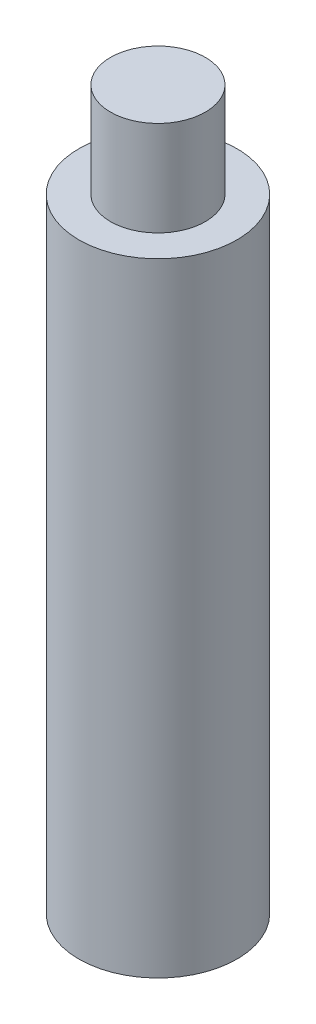
ISO-10303-21;
HEADER;
FILE_DESCRIPTION(('STEP AP214'),'2;1');
FILE_NAME('part.step','',(''),(''),'','','');
FILE_SCHEMA(('AUTOMOTIVE_DESIGN { 1 0 10303 214 1 1 1 1 }'));
ENDSEC;
DATA;
#1=APPLICATION_CONTEXT('core data for automotive mechanical design processes');
#2=APPLICATION_PROTOCOL_DEFINITION('international standard','automotive_design',2000,#1);
#3=PRODUCT_CONTEXT('',#1,'mechanical');
#4=PRODUCT('Part','Part','',(#3));
#5=PRODUCT_RELATED_PRODUCT_CATEGORY('part','',(#4));
#6=PRODUCT_DEFINITION_FORMATION('','',#4);
#7=PRODUCT_DEFINITION_CONTEXT('part definition',#1,'design');
#8=PRODUCT_DEFINITION('design','',#6,#7);
#9=PRODUCT_DEFINITION_SHAPE('','',#8);
#10=(LENGTH_UNIT() NAMED_UNIT(*) SI_UNIT(.MILLI.,.METRE.));
#11=(NAMED_UNIT(*) PLANE_ANGLE_UNIT() SI_UNIT($,.RADIAN.));
#12=(NAMED_UNIT(*) SI_UNIT($,.STERADIAN.) SOLID_ANGLE_UNIT());
#13=UNCERTAINTY_MEASURE_WITH_UNIT(LENGTH_MEASURE(1.E-05),#10,'distance_accuracy_value','');
#14=(GEOMETRIC_REPRESENTATION_CONTEXT(3) GLOBAL_UNCERTAINTY_ASSIGNED_CONTEXT((#13)) GLOBAL_UNIT_ASSIGNED_CONTEXT((#10,
#11,#12)) REPRESENTATION_CONTEXT('',''));
#15=CARTESIAN_POINT('',(0.,0.,0.));
#16=DIRECTION('',(0.,0.,1.));
#17=DIRECTION('',(1.,0.,0.));
#18=AXIS2_PLACEMENT_3D('',#15,#16,#17);
#19=CARTESIAN_POINT('',(0.,45.4,0.));
#20=DIRECTION('',(0.,1.,0.));
#21=DIRECTION('',(0.,0.,1.));
#22=AXIS2_PLACEMENT_3D('',#19,#20,#21);
#23=CYLINDRICAL_SURFACE('',#22,2.625);
#24=CARTESIAN_POINT('',(0.,39.4,0.));
#25=DIRECTION('',(0.,1.,0.));
#26=DIRECTION('',(0.,0.,1.));
#27=AXIS2_PLACEMENT_3D('',#24,#25,#26);
#28=CIRCLE('',#27,2.625);
#29=CARTESIAN_POINT('',(0.,39.4,2.625));
#30=VERTEX_POINT('',#29);
#31=EDGE_CURVE('P0_E21',#30,#30,#28,.T.);
#32=ORIENTED_EDGE('',*,*,#31,.T.);
#33=EDGE_LOOP('',(#32));
#34=FACE_BOUND('',#33,.T.);
#35=CARTESIAN_POINT('',(0.,45.4,0.));
#36=DIRECTION('',(0.,1.,0.));
#37=DIRECTION('',(0.,0.,1.));
#38=AXIS2_PLACEMENT_3D('',#35,#36,#37);
#39=CIRCLE('',#38,2.625);
#40=CARTESIAN_POINT('',(0.,45.4,2.625));
#41=VERTEX_POINT('',#40);
#42=EDGE_CURVE('P0_E11',#41,#41,#39,.F.);
#43=ORIENTED_EDGE('',*,*,#42,.T.);
#44=EDGE_LOOP('',(#43));
#45=FACE_BOUND('',#44,.T.);
#46=ADVANCED_FACE('P0_F17',(#34,#45),#23,.T.);
#47=CARTESIAN_POINT('',(0.,39.4,0.));
#48=DIRECTION('',(0.,1.,0.));
#49=DIRECTION('',(0.,0.,1.));
#50=AXIS2_PLACEMENT_3D('',#47,#48,#49);
#51=PLANE('',#50);
#52=ORIENTED_EDGE('',*,*,#31,.F.);
#53=EDGE_LOOP('',(#52));
#54=FACE_BOUND('',#53,.T.);
#55=CARTESIAN_POINT('',(3.,39.4,0.));
#56=CARTESIAN_POINT('',(2.99979758483912,39.4,-0.572474592038812));
#57=CARTESIAN_POINT('',(2.78936490318729,39.4,-1.10428412868562));
#58=CARTESIAN_POINT('',(2.56095382782096,39.4,-1.68152900910086));
#59=CARTESIAN_POINT('',(2.12132034355964,39.4,-2.12132034355964));
#60=CARTESIAN_POINT('',(1.68243191582797,39.4,-2.56036635397659));
#61=CARTESIAN_POINT('',(1.10428412868562,39.4,-2.78936490318729));
#62=CARTESIAN_POINT('',(0.572753802134251,39.4,-2.99989874306132));
#63=CARTESIAN_POINT('',(0.,39.4,-3.));
#64=CARTESIAN_POINT('',(-0.571707613467504,39.4,-3.00010107198336));
#65=CARTESIAN_POINT('',(-1.10428412868562,39.4,-2.78936490318729));
#66=CARTESIAN_POINT('',(-1.68152900910094,39.4,-2.56095382782087));
#67=CARTESIAN_POINT('',(-2.12132034355964,39.4,-2.12132034355964));
#68=CARTESIAN_POINT('',(-2.56036635397764,39.4,-1.68243191582692));
#69=CARTESIAN_POINT('',(-2.78936490318729,39.4,-1.10428412868562));
#70=CARTESIAN_POINT('',(-2.999797395646,39.4,-0.573009671805779));
#71=CARTESIAN_POINT('',(-3.,39.4,0.));
#72=B_SPLINE_CURVE_WITH_KNOTS('',2,(#55,#56,#57,#58,#59,#60,#61,#62,#63,#64,#65,#66,#67,#68,#69,
#70,#71),.UNSPECIFIED.,.F.,.F.,(3,2,2,2,2,2,2,2,3),(0.,0.125,0.25,0.375,0.5,0.625,0.75,0.875,
1.),.UNSPECIFIED.);
#73=CARTESIAN_POINT('',(3.,39.4,0.));
#74=VERTEX_POINT('',#73);
#75=CARTESIAN_POINT('',(-3.,39.4,0.));
#76=VERTEX_POINT('',#75);
#77=EDGE_CURVE('P0_E31',#74,#76,#72,.T.);
#78=ORIENTED_EDGE('',*,*,#77,.T.);
#79=CARTESIAN_POINT('',(-3.,39.4,0.));
#80=CARTESIAN_POINT('',(-2.99979758483912,39.4,0.572474592038812));
#81=CARTESIAN_POINT('',(-2.78936490318729,39.4,1.10428412868562));
#82=CARTESIAN_POINT('',(-2.56095382782096,39.4,1.68152900910086));
#83=CARTESIAN_POINT('',(-2.12132034355964,39.4,2.12132034355964));
#84=CARTESIAN_POINT('',(-1.68243191582797,39.4,2.56036635397659));
#85=CARTESIAN_POINT('',(-1.10428412868562,39.4,2.78936490318729));
#86=CARTESIAN_POINT('',(-0.572753802134251,39.4,2.99989874306132));
#87=CARTESIAN_POINT('',(0.,39.4,3.));
#88=CARTESIAN_POINT('',(0.571707613467504,39.4,3.00010107198336));
#89=CARTESIAN_POINT('',(1.10428412868562,39.4,2.78936490318729));
#90=CARTESIAN_POINT('',(1.68152900910094,39.4,2.56095382782087));
#91=CARTESIAN_POINT('',(2.12132034355964,39.4,2.12132034355964));
#92=CARTESIAN_POINT('',(2.56036635397764,39.4,1.68243191582692));
#93=CARTESIAN_POINT('',(2.78936490318729,39.4,1.10428412868562));
#94=CARTESIAN_POINT('',(2.999797395646,39.4,0.573009671805779));
#95=CARTESIAN_POINT('',(3.,39.4,0.));
#96=B_SPLINE_CURVE_WITH_KNOTS('',2,(#79,#80,#81,#82,#83,#84,#85,#86,#87,#88,#89,#90,#91,#92,#93,
#94,#95),.UNSPECIFIED.,.F.,.F.,(3,2,2,2,2,2,2,2,3),(0.,0.125,0.25,0.375,0.5,0.625,0.75,0.875,
1.),.UNSPECIFIED.);
#97=EDGE_CURVE('P0_E34',#76,#74,#96,.T.);
#98=ORIENTED_EDGE('',*,*,#97,.T.);
#99=EDGE_LOOP('',(#78,#98));
#100=FACE_BOUND('',#99,.T.);
#101=ADVANCED_FACE('P0_F18',(#54,#100),#51,.T.);
#102=OPEN_SHELL('',(#46,#101));
#103=SHELL_BASED_SURFACE_MODEL('P0_B1',(#102));
#104=CARTESIAN_POINT('',(0.,4.,0.));
#105=DIRECTION('',(0.,1.,0.));
#106=DIRECTION('',(0.,0.,1.));
#107=AXIS2_PLACEMENT_3D('',#104,#105,#106);
#108=PLANE('',#107);
#109=CARTESIAN_POINT('',(0.,4.,0.));
#110=DIRECTION('',(0.,1.,0.));
#111=DIRECTION('',(0.,0.,1.));
#112=AXIS2_PLACEMENT_3D('',#109,#110,#111);
#113=CIRCLE('',#112,0.3);
#114=CARTESIAN_POINT('',(0.,4.,0.3));
#115=VERTEX_POINT('',#114);
#116=EDGE_CURVE('P1_E18',#115,#115,#113,.F.);
#117=ORIENTED_EDGE('',*,*,#116,.T.);
#118=EDGE_LOOP('',(#117));
#119=FACE_BOUND('',#118,.T.);
#120=ADVANCED_FACE('P1_F15',(#119),#108,.F.);
#121=CARTESIAN_POINT('',(0.,45.4,0.));
#122=DIRECTION('',(0.,1.,0.));
#123=DIRECTION('',(0.,0.,1.));
#124=AXIS2_PLACEMENT_3D('',#121,#122,#123);
#125=PLANE('',#124);
#126=CARTESIAN_POINT('',(0.,45.4,0.));
#127=DIRECTION('',(0.,1.,0.));
#128=DIRECTION('',(0.,0.,1.));
#129=AXIS2_PLACEMENT_3D('',#126,#127,#128);
#130=CIRCLE('',#129,3.);
#131=CARTESIAN_POINT('',(0.,45.4,3.));
#132=VERTEX_POINT('',#131);
#133=EDGE_CURVE('P1_E34',#132,#132,#130,.F.);
#134=ORIENTED_EDGE('',*,*,#133,.F.);
#135=EDGE_LOOP('',(#134));
#136=FACE_BOUND('',#135,.T.);
#137=ADVANCED_FACE('P1_F46',(#136),#125,.T.);
#138=CARTESIAN_POINT('',(0.,0.,0.));
#139=DIRECTION('',(0.,1.,0.));
#140=DIRECTION('',(0.,0.,1.));
#141=AXIS2_PLACEMENT_3D('',#138,#139,#140);
#142=CYLINDRICAL_SURFACE('',#141,0.3);
#143=ORIENTED_EDGE('',*,*,#116,.F.);
#144=EDGE_LOOP('',(#143));
#145=FACE_BOUND('',#144,.T.);
#146=CARTESIAN_POINT('',(0.,0.,0.));
#147=DIRECTION('',(0.,1.,0.));
#148=DIRECTION('',(0.,0.,1.));
#149=AXIS2_PLACEMENT_3D('',#146,#147,#148);
#150=CIRCLE('',#149,0.3);
#151=CARTESIAN_POINT('',(0.,0.,0.3));
#152=VERTEX_POINT('',#151);
#153=EDGE_CURVE('P1_E32',#152,#152,#150,.F.);
#154=ORIENTED_EDGE('',*,*,#153,.T.);
#155=EDGE_LOOP('',(#154));
#156=FACE_BOUND('',#155,.T.);
#157=ADVANCED_FACE('P1_F42',(#145,#156),#142,.F.);
#158=CARTESIAN_POINT('',(0.,-2.27,0.));
#159=DIRECTION('',(0.,1.,0.));
#160=DIRECTION('',(0.,0.,1.));
#161=AXIS2_PLACEMENT_3D('',#158,#159,#160);
#162=CYLINDRICAL_SURFACE('',#161,3.);
#163=CARTESIAN_POINT('',(0.,39.4,0.));
#164=DIRECTION('',(0.,1.,0.));
#165=DIRECTION('',(0.,0.,1.));
#166=AXIS2_PLACEMENT_3D('',#163,#164,#165);
#167=CIRCLE('',#166,3.);
#168=CARTESIAN_POINT('',(0.,39.4,3.));
#169=VERTEX_POINT('',#168);
#170=EDGE_CURVE('P1_E27',#169,#169,#167,.F.);
#171=ORIENTED_EDGE('',*,*,#170,.F.);
#172=EDGE_LOOP('',(#171));
#173=FACE_BOUND('',#172,.T.);
#174=ORIENTED_EDGE('',*,*,#133,.T.);
#175=EDGE_LOOP('',(#174));
#176=FACE_BOUND('',#175,.T.);
#177=ADVANCED_FACE('P1_F45',(#173,#176),#162,.T.);
#178=CARTESIAN_POINT('',(0.,0.,0.));
#179=DIRECTION('',(0.,1.,0.));
#180=DIRECTION('',(0.,0.,1.));
#181=AXIS2_PLACEMENT_3D('',#178,#179,#180);
#182=PLANE('',#181);
#183=ORIENTED_EDGE('',*,*,#153,.F.);
#184=EDGE_LOOP('',(#183));
#185=FACE_BOUND('',#184,.T.);
#186=CARTESIAN_POINT('',(0.,0.,0.));
#187=DIRECTION('',(0.,1.,0.));
#188=DIRECTION('',(0.,0.,1.));
#189=AXIS2_PLACEMENT_3D('',#186,#187,#188);
#190=CIRCLE('',#189,5.);
#191=CARTESIAN_POINT('',(0.,0.,5.));
#192=VERTEX_POINT('',#191);
#193=EDGE_CURVE('P1_E22',#192,#192,#190,.T.);
#194=ORIENTED_EDGE('',*,*,#193,.F.);
#195=EDGE_LOOP('',(#194));
#196=FACE_BOUND('',#195,.T.);
#197=ADVANCED_FACE('P1_F50',(#185,#196),#182,.F.);
#198=CARTESIAN_POINT('',(0.,39.4,0.));
#199=DIRECTION('',(0.,1.,0.));
#200=DIRECTION('',(0.,0.,1.));
#201=AXIS2_PLACEMENT_3D('',#198,#199,#200);
#202=PLANE('',#201);
#203=ORIENTED_EDGE('',*,*,#170,.T.);
#204=EDGE_LOOP('',(#203));
#205=FACE_BOUND('',#204,.T.);
#206=CARTESIAN_POINT('',(0.,39.4,0.));
#207=DIRECTION('',(0.,1.,0.));
#208=DIRECTION('',(0.,0.,1.));
#209=AXIS2_PLACEMENT_3D('',#206,#207,#208);
#210=CIRCLE('',#209,5.);
#211=CARTESIAN_POINT('',(0.,39.4,5.));
#212=VERTEX_POINT('',#211);
#213=EDGE_CURVE('P1_E10',#212,#212,#210,.F.);
#214=ORIENTED_EDGE('',*,*,#213,.F.);
#215=EDGE_LOOP('',(#214));
#216=FACE_BOUND('',#215,.T.);
#217=ADVANCED_FACE('P1_F53',(#205,#216),#202,.T.);
#218=CARTESIAN_POINT('',(0.,-2.27,0.));
#219=DIRECTION('',(0.,1.,0.));
#220=DIRECTION('',(0.,0.,1.));
#221=AXIS2_PLACEMENT_3D('',#218,#219,#220);
#222=CYLINDRICAL_SURFACE('',#221,5.);
#223=ORIENTED_EDGE('',*,*,#213,.T.);
#224=EDGE_LOOP('',(#223));
#225=FACE_BOUND('',#224,.T.);
#226=ORIENTED_EDGE('',*,*,#193,.T.);
#227=EDGE_LOOP('',(#226));
#228=FACE_BOUND('',#227,.T.);
#229=ADVANCED_FACE('P1_F57',(#225,#228),#222,.T.);
#230=CLOSED_SHELL('',(#120,#137,#157,#177,#197,#217,#229));
#231=MANIFOLD_SOLID_BREP('P1_B1',#230);
#232=ADVANCED_BREP_SHAPE_REPRESENTATION('',(#18,#231),#14);
#233=MANIFOLD_SURFACE_SHAPE_REPRESENTATION('',(#18,#103),#14);
#234=SHAPE_REPRESENTATION('',(#18),#14);
#235=SHAPE_DEFINITION_REPRESENTATION(#9,#234);
#236=SHAPE_REPRESENTATION_RELATIONSHIP('','',#234,#232);
#237=SHAPE_REPRESENTATION_RELATIONSHIP('','',#234,#233);
ENDSEC;
END-ISO-10303-21;
